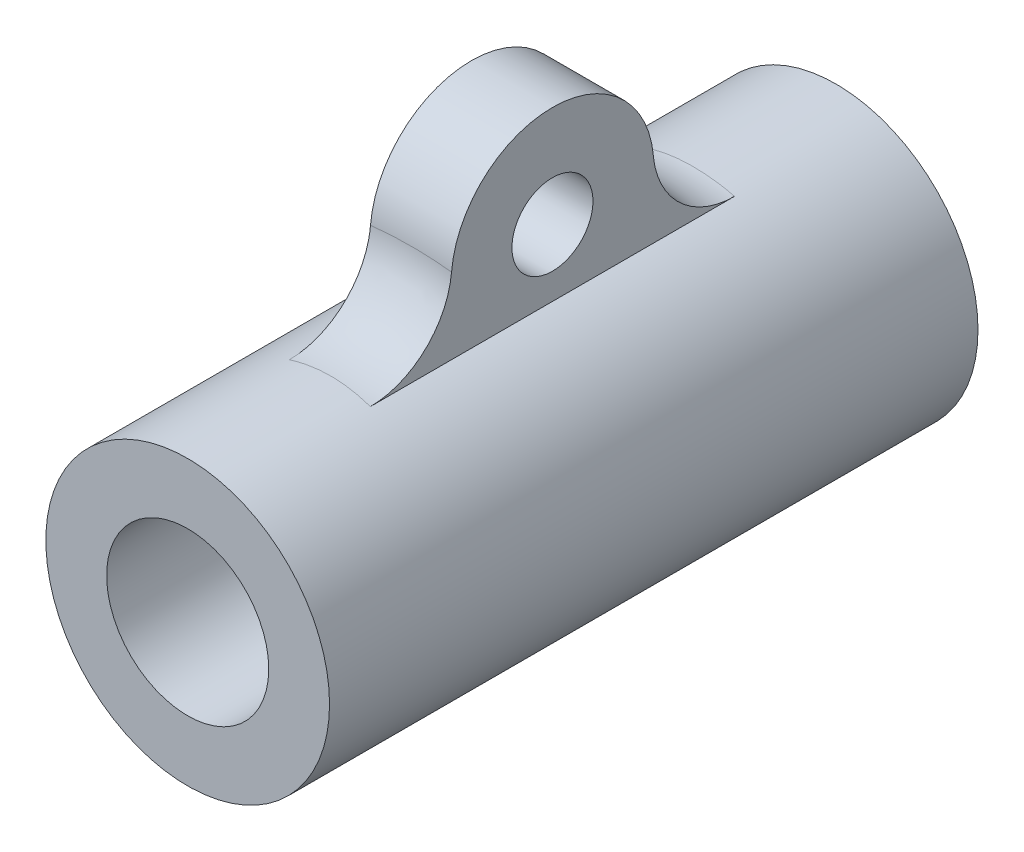
ISO-10303-21;
HEADER;
FILE_DESCRIPTION(('STEP AP214'),'2;1');
FILE_NAME('part.step','',(''),(''),'','','');
FILE_SCHEMA(('AUTOMOTIVE_DESIGN { 1 0 10303 214 1 1 1 1 }'));
ENDSEC;
DATA;
#1=APPLICATION_CONTEXT('core data for automotive mechanical design processes');
#2=APPLICATION_PROTOCOL_DEFINITION('international standard','automotive_design',2000,#1);
#3=PRODUCT_CONTEXT('',#1,'mechanical');
#4=PRODUCT('Part','Part','',(#3));
#5=PRODUCT_RELATED_PRODUCT_CATEGORY('part','',(#4));
#6=PRODUCT_DEFINITION_FORMATION('','',#4);
#7=PRODUCT_DEFINITION_CONTEXT('part definition',#1,'design');
#8=PRODUCT_DEFINITION('design','',#6,#7);
#9=PRODUCT_DEFINITION_SHAPE('','',#8);
#10=(LENGTH_UNIT() NAMED_UNIT(*) SI_UNIT(.MILLI.,.METRE.));
#11=(NAMED_UNIT(*) PLANE_ANGLE_UNIT() SI_UNIT($,.RADIAN.));
#12=(NAMED_UNIT(*) SI_UNIT($,.STERADIAN.) SOLID_ANGLE_UNIT());
#13=UNCERTAINTY_MEASURE_WITH_UNIT(LENGTH_MEASURE(1.E-05),#10,'distance_accuracy_value','');
#14=(GEOMETRIC_REPRESENTATION_CONTEXT(3) GLOBAL_UNCERTAINTY_ASSIGNED_CONTEXT((#13)) GLOBAL_UNIT_ASSIGNED_CONTEXT((#10,
#11,#12)) REPRESENTATION_CONTEXT('',''));
#15=CARTESIAN_POINT('',(0.,0.,0.));
#16=DIRECTION('',(0.,0.,1.));
#17=DIRECTION('',(1.,0.,0.));
#18=AXIS2_PLACEMENT_3D('',#15,#16,#17);
#19=CARTESIAN_POINT('',(0.,0.,25.4));
#20=DIRECTION('',(0.,0.,1.));
#21=DIRECTION('',(1.,0.,0.));
#22=AXIS2_PLACEMENT_3D('',#19,#20,#21);
#23=PLANE('',#22);
#24=CARTESIAN_POINT('',(0.,0.,25.4));
#25=DIRECTION('',(0.,0.,1.));
#26=DIRECTION('',(1.,0.,0.));
#27=AXIS2_PLACEMENT_3D('',#24,#25,#26);
#28=CIRCLE('',#27,11.1125);
#29=CARTESIAN_POINT('',(11.1125,0.,25.4));
#30=VERTEX_POINT('',#29);
#31=EDGE_CURVE('E219',#30,#30,#28,.T.);
#32=ORIENTED_EDGE('',*,*,#31,.T.);
#33=EDGE_LOOP('',(#32));
#34=FACE_BOUND('',#33,.T.);
#35=CARTESIAN_POINT('',(0.,0.,25.4));
#36=DIRECTION('',(0.,0.,1.));
#37=DIRECTION('',(1.,0.,0.));
#38=AXIS2_PLACEMENT_3D('',#35,#36,#37);
#39=CIRCLE('',#38,6.35);
#40=CARTESIAN_POINT('',(6.35,0.,25.4));
#41=VERTEX_POINT('',#40);
#42=EDGE_CURVE('E213',#41,#41,#39,.T.);
#43=ORIENTED_EDGE('',*,*,#42,.F.);
#44=EDGE_LOOP('',(#43));
#45=FACE_BOUND('',#44,.T.);
#46=ADVANCED_FACE('F39',(#34,#45),#23,.T.);
#47=CARTESIAN_POINT('',(0.,0.,-25.4));
#48=DIRECTION('',(0.,0.,1.));
#49=DIRECTION('',(1.,0.,0.));
#50=AXIS2_PLACEMENT_3D('',#47,#48,#49);
#51=PLANE('',#50);
#52=CARTESIAN_POINT('',(0.,0.,-25.4));
#53=DIRECTION('',(0.,0.,1.));
#54=DIRECTION('',(1.,0.,0.));
#55=AXIS2_PLACEMENT_3D('',#52,#53,#54);
#56=CIRCLE('',#55,11.1125);
#57=CARTESIAN_POINT('',(11.1125,0.,-25.4));
#58=VERTEX_POINT('',#57);
#59=EDGE_CURVE('E216',#58,#58,#56,.T.);
#60=ORIENTED_EDGE('',*,*,#59,.F.);
#61=EDGE_LOOP('',(#60));
#62=FACE_BOUND('',#61,.T.);
#63=CARTESIAN_POINT('',(0.,0.,-25.4));
#64=DIRECTION('',(0.,0.,1.));
#65=DIRECTION('',(1.,0.,0.));
#66=AXIS2_PLACEMENT_3D('',#63,#64,#65);
#67=CIRCLE('',#66,6.35);
#68=CARTESIAN_POINT('',(6.35,0.,-25.4));
#69=VERTEX_POINT('',#68);
#70=EDGE_CURVE('E100',#69,#69,#67,.T.);
#71=ORIENTED_EDGE('',*,*,#70,.T.);
#72=EDGE_LOOP('',(#71));
#73=FACE_BOUND('',#72,.T.);
#74=ADVANCED_FACE('F153',(#62,#73),#51,.F.);
#75=CARTESIAN_POINT('',(0.,0.,25.4));
#76=DIRECTION('',(0.,0.,-1.));
#77=DIRECTION('',(-1.,0.,0.));
#78=AXIS2_PLACEMENT_3D('',#75,#76,#77);
#79=CYLINDRICAL_SURFACE('',#78,11.1125);
#80=DIRECTION('',(0.,0.,-1.));
#81=VECTOR('',#80,1.);
#82=CARTESIAN_POINT('',(3.175,10.6492737428428,25.4));
#83=LINE('',#82,#81);
#84=CARTESIAN_POINT('',(3.175,10.6492737428428,-14.2616194895814));
#85=VERTEX_POINT('',#84);
#86=CARTESIAN_POINT('',(3.175,10.6492737428428,14.2616194895814));
#87=VERTEX_POINT('',#86);
#88=EDGE_CURVE('E60',#85,#87,#83,.F.);
#89=ORIENTED_EDGE('',*,*,#88,.T.);
#90=CARTESIAN_POINT('',(4.46461379024299,10.1761918198299,14.2870278027196));
#91=CARTESIAN_POINT('',(4.48346733485135,10.1679201798349,7.98416291189731));
#92=CARTESIAN_POINT('',(7.01582167038185,15.9395325411213,7.93723766817754));
#93=CARTESIAN_POINT('',(4.33154014334243,10.2345753046005,14.2862772176435));
#94=CARTESIAN_POINT('',(4.36508340525394,10.2201647314617,8.02070093490109));
#95=CARTESIAN_POINT('',(6.80670593953739,15.9905022500984,7.93682067764308));
#96=CARTESIAN_POINT('',(4.19733848308518,10.2903407112571,14.2846862781797));
#97=CARTESIAN_POINT('',(4.24317385232084,10.2714958532903,8.05519035271239));
#98=CARTESIAN_POINT('',(6.59581761627624,16.0391863352578,7.93593682199012));
#99=CARTESIAN_POINT('',(3.92686122010344,10.3965634598014,14.2802585444643));
#100=CARTESIAN_POINT('',(3.99356538053318,10.371207010043,8.11995528150882));
#101=CARTESIAN_POINT('',(6.17078191730588,16.1319204807454,7.93347696835723));
#102=CARTESIAN_POINT('',(3.79058565282938,10.447020892305,14.2774217714853));
#103=CARTESIAN_POINT('',(3.86584534760146,10.4196239983928,8.15026724032915));
#104=CARTESIAN_POINT('',(5.95663459730451,16.1759706201827,7.93190098219548));
#105=CARTESIAN_POINT('',(3.37886868633746,10.5903421161357,14.2676937899221));
#106=CARTESIAN_POINT('',(3.47562756976165,10.5590380920943,8.23493283427822));
#107=CARTESIAN_POINT('',(5.3096507928179,16.3010923234805,7.92649654684823));
#108=CARTESIAN_POINT('',(3.1005814032622,10.6751353674889,14.2595854575633));
#109=CARTESIAN_POINT('',(3.20397455295219,10.6451040597964,8.28361720980116));
#110=CARTESIAN_POINT('',(4.87234220512678,16.3751181779433,7.92199192016393));
#111=CARTESIAN_POINT('',(2.5394613013871,10.8223190075173,14.2430944767544));
#112=CARTESIAN_POINT('',(2.6456226580094,10.7973495220386,8.36603781195924));
#113=CARTESIAN_POINT('',(3.99058204503641,16.5036118319827,7.9128302655651));
#114=CARTESIAN_POINT('',(2.25665311339662,10.8848039715464,14.2347131547851));
#115=CARTESIAN_POINT('',(2.35854284241874,10.8639190437405,8.40003507527986));
#116=CARTESIAN_POINT('',(3.54616917819472,16.5581621973452,7.90817397459888));
#117=CARTESIAN_POINT('',(1.68710927015211,10.9874927366723,14.2198521062712));
#118=CARTESIAN_POINT('',(1.77339179131906,10.9744348597025,8.45487070671548));
#119=CARTESIAN_POINT('',(2.65117171023933,16.6478111192628,7.89991783610144));
#120=CARTESIAN_POINT('',(1.40037535091559,11.0277060800149,14.2133715659));
#121=CARTESIAN_POINT('',(1.47472199178352,11.0186395215983,8.4758486485888));
#122=CARTESIAN_POINT('',(2.20058983715315,16.68291800635,7.89631753644367));
#123=CARTESIAN_POINT('',(0.849455389387629,11.0831398301495,14.2041747134168));
#124=CARTESIAN_POINT('',(0.897393181636988,11.0797612606944,8.50447459368468));
#125=CARTESIAN_POINT('',(1.33485846903763,16.7313125501417,7.89120817427347));
#126=CARTESIAN_POINT('',(0.585456263917187,11.1002158149128,14.2011820796085));
#127=CARTESIAN_POINT('',(0.618738317790818,11.0988175412265,8.51317123286857));
#128=CARTESIAN_POINT('',(0.920002700441267,16.7462201558739,7.88954559977035));
#129=CARTESIAN_POINT('',(0.0569031199796205,11.1154993305016,14.1985087057142));
#130=CARTESIAN_POINT('',(0.0603920051670209,11.1158340260266,8.52094443117031));
#131=CARTESIAN_POINT('',(0.0894191885394314,16.7595629075832,7.88806039207555));
#132=CARTESIAN_POINT('',(-0.207650911698906,11.1137064068724,14.1988280453965));
#133=CARTESIAN_POINT('',(-0.219867384558824,11.11382845606,8.52003661138951));
#134=CARTESIAN_POINT('',(-0.326308575526816,16.7579976568141,7.88823780319964));
#135=CARTESIAN_POINT('',(-0.78234165500161,11.0892817850724,14.2030818515208));
#136=CARTESIAN_POINT('',(-0.826495358882273,11.0866506766782,8.50759511501453));
#137=CARTESIAN_POINT('',(-1.22939402928829,16.7366745742452,7.89060102838574));
#138=CARTESIAN_POINT('',(-1.09233003569768,11.06304820666,14.2076409192529));
#139=CARTESIAN_POINT('',(-1.15309781536816,11.0573985977466,8.4941897774203));
#140=CARTESIAN_POINT('',(-1.71651862752507,16.7137722438067,7.89313384301525));
#141=CARTESIAN_POINT('',(-1.70913083281278,10.9846827891209,14.2201851110168));
#142=CARTESIAN_POINT('',(-1.79597916523198,10.9715670630338,8.45334240345556));
#143=CARTESIAN_POINT('',(-2.68577702299167,16.6453579903979,7.90010283842069));
#144=CARTESIAN_POINT('',(-2.01594144776982,10.9325370017025,14.2281720799386));
#145=CARTESIAN_POINT('',(-2.11309006429761,10.9147394871698,8.42577736176764));
#146=CARTESIAN_POINT('',(-3.16790798935262,16.5998338903476,7.90454004413639));
#147=CARTESIAN_POINT('',(-2.62571073255053,10.8023587244268,14.2454541125462));
#148=CARTESIAN_POINT('',(-2.73240391686623,10.7766039199111,8.35499423410979));
#149=CARTESIAN_POINT('',(-4.12611686543651,16.4861861880194,7.91414117391218));
#150=CARTESIAN_POINT('',(-2.92864128342633,10.7241937808338,14.2547557262412));
#151=CARTESIAN_POINT('',(-3.0352025042978,10.6948228203801,8.3114956764691));
#152=CARTESIAN_POINT('',(-4.60215058824137,16.4179469515274,7.91930873686127));
#153=CARTESIAN_POINT('',(-3.37715851757639,10.5880537704912,14.2672690450642));
#154=CARTESIAN_POINT('',(-3.47138162028122,10.5579556315964,8.23339581834799));
#155=CARTESIAN_POINT('',(-5.3069633847629,16.299094561537,7.92626058056095));
#156=CARTESIAN_POINT('',(-3.52566641207028,10.5395322022595,14.2711999020517));
#157=CARTESIAN_POINT('',(-3.61436063792985,10.509738204485,8.20507920044447));
#158=CARTESIAN_POINT('',(-5.5403329332533,16.2567344622883,7.92844439000668));
#159=CARTESIAN_POINT('',(-3.8205143879583,10.4362693951329,14.2780863267374));
#160=CARTESIAN_POINT('',(-3.89413785784157,10.409209416567,8.14384381536831));
#161=CARTESIAN_POINT('',(-6.00366546679161,16.1665843925772,7.93227018152216));
#162=CARTESIAN_POINT('',(-3.96685445031512,10.3815281016545,14.2810418858757));
#163=CARTESIAN_POINT('',(-4.03097785360912,10.3568490593557,8.11088385781185));
#164=CARTESIAN_POINT('',(-6.23362842192377,16.1187943744626,7.93391215883637));
#165=CARTESIAN_POINT('',(-4.11199847605204,10.3237166167493,14.2832616689717));
#166=CARTESIAN_POINT('',(-4.16398898362548,10.3030084846059,8.07560581518497));
#167=CARTESIAN_POINT('',(-6.46171189093892,16.0683240304954,7.93514537165092));
#168=(BOUNDED_SURFACE() B_SPLINE_SURFACE(3,2,((#90,#91,#92),(#93,#94,#95),(#96,#97,#98),(#99,
#100,#101),(#102,#103,#104),(#105,#106,#107),(#108,#109,#110),(#111,#112,#113),(#114,#115,#116),
(#117,#118,#119),(#120,#121,#122),(#123,#124,#125),(#126,#127,#128),(#129,#130,#131),(#132,#133,
#134),(#135,#136,#137),(#138,#139,#140),(#141,#142,#143),(#144,#145,#146),(#147,#148,#149),
(#150,#151,#152),(#153,#154,#155),(#156,#157,#158),(#159,#160,#161),(#162,#163,#164),(#165,#166,
#167)),.UNSPECIFIED.,.F.,.F.,.F.) B_SPLINE_SURFACE_WITH_KNOTS((4,2,2,2,2,2,2,2,2,2,2,2,4),(3,3),
(0.,0.684975155164863,1.36993861479184,2.74009336205547,4.10436839973577,5.46805846253239,
6.71419922149175,7.96036999362854,9.4252374346861,10.8908942553011,12.3641292897719,
13.100563848175,13.8370048699137),(0.,1.),
.UNSPECIFIED.) GEOMETRIC_REPRESENTATION_ITEM() RATIONAL_B_SPLINE_SURFACE(((1.,0.709734128311728,
1.),(1.,0.711820719538304,1.),(1.,0.713839715172821,1.),(1.,0.717726305382431,1.),(1.,
0.719593902542017,1.),(1.,0.724945979482716,1.),(1.,0.728179039940343,1.),(1.,0.73385623676971,
1.),(1.,0.736303699094032,1.),(1.,0.740354264436762,1.),(1.,0.74195772905022,1.),(1.,
0.744174802408058,1.),(1.,0.744861821872912,1.),(1.,0.745476597934358,1.),(1.,0.74540433624378,
1.),(1.,0.744422325782521,1.),(1.,0.743367827814133,1.),(1.,0.740245367002487,1.),(1.,
0.738176858335169,1.),(1.,0.733083065161156,1.),(1.,0.730052888922134,1.),(1.,0.724877041894932,
1.),(1.,0.723046928955433,1.),(1.,0.719194270430117,1.),(1.,0.717171723155552,1.),(1.,
0.715061874987908,1.))) REPRESENTATION_ITEM('') SURFACE());
#169=CARTESIAN_POINT('',(4.46461379024299,10.1761918198299,14.2870278027196));
#170=CARTESIAN_POINT('',(4.33154014334243,10.2345753046005,14.2862772176435));
#171=CARTESIAN_POINT('',(4.19733848308518,10.2903407112571,14.2846862781797));
#172=CARTESIAN_POINT('',(3.92686122010344,10.3965634598014,14.2802585444643));
#173=CARTESIAN_POINT('',(3.79058565282938,10.447020892305,14.2774217714853));
#174=CARTESIAN_POINT('',(3.37886868633746,10.5903421161357,14.2676937899221));
#175=CARTESIAN_POINT('',(3.1005814032622,10.6751353674889,14.2595854575633));
#176=CARTESIAN_POINT('',(2.5394613013871,10.8223190075173,14.2430944767544));
#177=CARTESIAN_POINT('',(2.25665311339662,10.8848039715464,14.2347131547851));
#178=CARTESIAN_POINT('',(1.68710927015211,10.9874927366723,14.2198521062712));
#179=CARTESIAN_POINT('',(1.40037535091559,11.0277060800149,14.2133715659));
#180=CARTESIAN_POINT('',(0.849455389387629,11.0831398301495,14.2041747134168));
#181=CARTESIAN_POINT('',(0.585456263917187,11.1002158149128,14.2011820796085));
#182=CARTESIAN_POINT('',(0.0569031199796205,11.1154993305016,14.1985087057142));
#183=CARTESIAN_POINT('',(-0.207650911698906,11.1137064068724,14.1988280453965));
#184=CARTESIAN_POINT('',(-0.782341655001609,11.0892817850724,14.2030818515208));
#185=CARTESIAN_POINT('',(-1.09233003569768,11.06304820666,14.2076409192529));
#186=CARTESIAN_POINT('',(-1.70913083281278,10.9846827891209,14.2201851110168));
#187=CARTESIAN_POINT('',(-2.01594144776982,10.9325370017025,14.2281720799386));
#188=CARTESIAN_POINT('',(-2.62571073255053,10.8023587244268,14.2454541125462));
#189=CARTESIAN_POINT('',(-2.92864128342633,10.7241937808338,14.2547557262412));
#190=CARTESIAN_POINT('',(-3.37715851757639,10.5880537704912,14.2672690450642));
#191=CARTESIAN_POINT('',(-3.52566641207028,10.5395322022595,14.2711999020517));
#192=CARTESIAN_POINT('',(-3.8205143879583,10.4362693951329,14.2780863267374));
#193=CARTESIAN_POINT('',(-3.96685445031512,10.3815281016545,14.2810418858758));
#194=CARTESIAN_POINT('',(-4.11199847605204,10.3237166167493,14.2832616689717));
#195=B_SPLINE_CURVE_WITH_KNOTS('',3,(#169,#170,#171,#172,#173,#174,#175,#176,#177,#178,#179,
#180,#181,#182,#183,#184,#185,#186,#187,#188,#189,#190,#191,#192,#193,#194),.UNSPECIFIED.,.F.,
.F.,(4,2,2,2,2,2,2,2,2,2,2,2,4),(0.,0.684975155164863,1.36993861479184,2.74009336205547,
4.10436839973577,5.46805846253239,6.71419922149175,7.96036999362854,9.4252374346861,
10.8908942553011,12.3641292897719,13.100563848175,13.8370048699137),.UNSPECIFIED.);
#196=CARTESIAN_POINT('',(-3.175,10.6492737428428,14.2616194895814));
#197=VERTEX_POINT('',#196);
#198=EDGE_CURVE('E158',#87,#197,#195,.T.);
#199=ORIENTED_EDGE('',*,*,#198,.T.);
#200=DIRECTION('',(0.,0.,-1.));
#201=VECTOR('',#200,1.);
#202=CARTESIAN_POINT('',(-3.175,10.6492737428428,25.4));
#203=LINE('',#202,#201);
#204=CARTESIAN_POINT('',(-3.175,10.6492737428428,-14.2616194895814));
#205=VERTEX_POINT('',#204);
#206=EDGE_CURVE('E68',#205,#197,#203,.F.);
#207=ORIENTED_EDGE('',*,*,#206,.F.);
#208=CARTESIAN_POINT('',(-4.46461379024299,10.1761918198299,-14.2870278027196));
#209=CARTESIAN_POINT('',(-4.48346733485135,10.1679201798349,-7.98416291189731));
#210=CARTESIAN_POINT('',(-7.01582167038185,15.9395325411213,-7.93723766817754));
#211=CARTESIAN_POINT('',(-4.33154014334243,10.2345753046005,-14.2862772176435));
#212=CARTESIAN_POINT('',(-4.36508340525394,10.2201647314617,-8.02070093490109));
#213=CARTESIAN_POINT('',(-6.80670593953739,15.9905022500984,-7.93682067764308));
#214=CARTESIAN_POINT('',(-4.19733848308518,10.2903407112571,-14.2846862781797));
#215=CARTESIAN_POINT('',(-4.24317385232084,10.2714958532903,-8.05519035271239));
#216=CARTESIAN_POINT('',(-6.59581761627624,16.0391863352578,-7.93593682199012));
#217=CARTESIAN_POINT('',(-3.92686122010344,10.3965634598014,-14.2802585444643));
#218=CARTESIAN_POINT('',(-3.99356538053318,10.371207010043,-8.11995528150882));
#219=CARTESIAN_POINT('',(-6.17078191730588,16.1319204807454,-7.93347696835723));
#220=CARTESIAN_POINT('',(-3.79058565282938,10.447020892305,-14.2774217714853));
#221=CARTESIAN_POINT('',(-3.86584534760146,10.4196239983928,-8.15026724032915));
#222=CARTESIAN_POINT('',(-5.95663459730451,16.1759706201827,-7.93190098219548));
#223=CARTESIAN_POINT('',(-3.37886868633746,10.5903421161357,-14.2676937899221));
#224=CARTESIAN_POINT('',(-3.47562756976165,10.5590380920943,-8.23493283427822));
#225=CARTESIAN_POINT('',(-5.3096507928179,16.3010923234805,-7.92649654684823));
#226=CARTESIAN_POINT('',(-3.1005814032622,10.6751353674889,-14.2595854575633));
#227=CARTESIAN_POINT('',(-3.20397455295219,10.6451040597964,-8.28361720980116));
#228=CARTESIAN_POINT('',(-4.87234220512678,16.3751181779433,-7.92199192016393));
#229=CARTESIAN_POINT('',(-2.5394613013871,10.8223190075173,-14.2430944767544));
#230=CARTESIAN_POINT('',(-2.6456226580094,10.7973495220386,-8.36603781195924));
#231=CARTESIAN_POINT('',(-3.99058204503641,16.5036118319827,-7.9128302655651));
#232=CARTESIAN_POINT('',(-2.25665311339662,10.8848039715464,-14.2347131547851));
#233=CARTESIAN_POINT('',(-2.35854284241874,10.8639190437405,-8.40003507527986));
#234=CARTESIAN_POINT('',(-3.54616917819472,16.5581621973452,-7.90817397459888));
#235=CARTESIAN_POINT('',(-1.68710927015211,10.9874927366723,-14.2198521062712));
#236=CARTESIAN_POINT('',(-1.77339179131906,10.9744348597025,-8.45487070671548));
#237=CARTESIAN_POINT('',(-2.65117171023933,16.6478111192628,-7.89991783610144));
#238=CARTESIAN_POINT('',(-1.40037535091559,11.0277060800149,-14.2133715659));
#239=CARTESIAN_POINT('',(-1.47472199178352,11.0186395215983,-8.4758486485888));
#240=CARTESIAN_POINT('',(-2.20058983715315,16.68291800635,-7.89631753644367));
#241=CARTESIAN_POINT('',(-0.849455389387629,11.0831398301495,-14.2041747134168));
#242=CARTESIAN_POINT('',(-0.897393181636988,11.0797612606944,-8.50447459368468));
#243=CARTESIAN_POINT('',(-1.33485846903763,16.7313125501417,-7.89120817427347));
#244=CARTESIAN_POINT('',(-0.585456263917187,11.1002158149128,-14.2011820796085));
#245=CARTESIAN_POINT('',(-0.618738317790818,11.0988175412265,-8.51317123286857));
#246=CARTESIAN_POINT('',(-0.920002700441267,16.7462201558739,-7.88954559977035));
#247=CARTESIAN_POINT('',(-0.0569031199796205,11.1154993305016,-14.1985087057142));
#248=CARTESIAN_POINT('',(-0.0603920051670209,11.1158340260266,-8.52094443117031));
#249=CARTESIAN_POINT('',(-0.0894191885394314,16.7595629075832,-7.88806039207555));
#250=CARTESIAN_POINT('',(0.207650911698906,11.1137064068724,-14.1988280453965));
#251=CARTESIAN_POINT('',(0.219867384558824,11.11382845606,-8.52003661138951));
#252=CARTESIAN_POINT('',(0.326308575526816,16.7579976568141,-7.88823780319964));
#253=CARTESIAN_POINT('',(0.78234165500161,11.0892817850724,-14.2030818515208));
#254=CARTESIAN_POINT('',(0.826495358882273,11.0866506766782,-8.50759511501453));
#255=CARTESIAN_POINT('',(1.22939402928829,16.7366745742452,-7.89060102838574));
#256=CARTESIAN_POINT('',(1.09233003569768,11.06304820666,-14.2076409192529));
#257=CARTESIAN_POINT('',(1.15309781536816,11.0573985977466,-8.4941897774203));
#258=CARTESIAN_POINT('',(1.71651862752507,16.7137722438067,-7.89313384301525));
#259=CARTESIAN_POINT('',(1.70913083281278,10.9846827891209,-14.2201851110168));
#260=CARTESIAN_POINT('',(1.79597916523198,10.9715670630338,-8.45334240345556));
#261=CARTESIAN_POINT('',(2.68577702299167,16.6453579903979,-7.90010283842069));
#262=CARTESIAN_POINT('',(2.01594144776982,10.9325370017025,-14.2281720799386));
#263=CARTESIAN_POINT('',(2.11309006429761,10.9147394871698,-8.42577736176764));
#264=CARTESIAN_POINT('',(3.16790798935262,16.5998338903476,-7.90454004413639));
#265=CARTESIAN_POINT('',(2.62571073255053,10.8023587244268,-14.2454541125462));
#266=CARTESIAN_POINT('',(2.73240391686623,10.7766039199111,-8.35499423410979));
#267=CARTESIAN_POINT('',(4.12611686543651,16.4861861880194,-7.91414117391218));
#268=CARTESIAN_POINT('',(2.92864128342633,10.7241937808338,-14.2547557262412));
#269=CARTESIAN_POINT('',(3.0352025042978,10.6948228203801,-8.3114956764691));
#270=CARTESIAN_POINT('',(4.60215058824137,16.4179469515274,-7.91930873686127));
#271=CARTESIAN_POINT('',(3.37715851757639,10.5880537704912,-14.2672690450642));
#272=CARTESIAN_POINT('',(3.47138162028122,10.5579556315964,-8.23339581834799));
#273=CARTESIAN_POINT('',(5.3069633847629,16.299094561537,-7.92626058056095));
#274=CARTESIAN_POINT('',(3.52566641207028,10.5395322022595,-14.2711999020517));
#275=CARTESIAN_POINT('',(3.61436063792985,10.509738204485,-8.20507920044447));
#276=CARTESIAN_POINT('',(5.5403329332533,16.2567344622883,-7.92844439000668));
#277=CARTESIAN_POINT('',(3.8205143879583,10.4362693951329,-14.2780863267374));
#278=CARTESIAN_POINT('',(3.89413785784157,10.409209416567,-8.14384381536831));
#279=CARTESIAN_POINT('',(6.00366546679161,16.1665843925772,-7.93227018152216));
#280=CARTESIAN_POINT('',(3.96685445031512,10.3815281016545,-14.2810418858757));
#281=CARTESIAN_POINT('',(4.03097785360912,10.3568490593557,-8.11088385781185));
#282=CARTESIAN_POINT('',(6.23362842192377,16.1187943744626,-7.93391215883637));
#283=CARTESIAN_POINT('',(4.11199847605204,10.3237166167493,-14.2832616689717));
#284=CARTESIAN_POINT('',(4.16398898362548,10.3030084846059,-8.07560581518497));
#285=CARTESIAN_POINT('',(6.46171189093892,16.0683240304954,-7.93514537165092));
#286=(BOUNDED_SURFACE() B_SPLINE_SURFACE(3,2,((#208,#209,#210),(#211,#212,#213),(#214,#215,
#216),(#217,#218,#219),(#220,#221,#222),(#223,#224,#225),(#226,#227,#228),(#229,#230,#231),
(#232,#233,#234),(#235,#236,#237),(#238,#239,#240),(#241,#242,#243),(#244,#245,#246),(#247,#248,
#249),(#250,#251,#252),(#253,#254,#255),(#256,#257,#258),(#259,#260,#261),(#262,#263,#264),
(#265,#266,#267),(#268,#269,#270),(#271,#272,#273),(#274,#275,#276),(#277,#278,#279),(#280,#281,
#282),(#283,#284,#285)),.UNSPECIFIED.,.F.,.F.,.F.) B_SPLINE_SURFACE_WITH_KNOTS((4,2,2,2,2,2,2,2,
2,2,2,2,4),(3,3),(0.,0.684975155164863,1.36993861479184,2.74009336205547,4.10436839973577,
5.46805846253239,6.71419922149175,7.96036999362854,9.4252374346861,10.8908942553011,
12.3641292897719,13.100563848175,13.8370048699137),(0.,1.),
.UNSPECIFIED.) GEOMETRIC_REPRESENTATION_ITEM() RATIONAL_B_SPLINE_SURFACE(((1.,0.709734128311728,
1.),(1.,0.711820719538304,1.),(1.,0.713839715172821,1.),(1.,0.717726305382431,1.),(1.,
0.719593902542017,1.),(1.,0.724945979482716,1.),(1.,0.728179039940343,1.),(1.,0.73385623676971,
1.),(1.,0.736303699094032,1.),(1.,0.740354264436762,1.),(1.,0.74195772905022,1.),(1.,
0.744174802408058,1.),(1.,0.744861821872912,1.),(1.,0.745476597934358,1.),(1.,0.74540433624378,
1.),(1.,0.744422325782521,1.),(1.,0.743367827814133,1.),(1.,0.740245367002487,1.),(1.,
0.738176858335169,1.),(1.,0.733083065161156,1.),(1.,0.730052888922134,1.),(1.,0.724877041894932,
1.),(1.,0.723046928955433,1.),(1.,0.719194270430117,1.),(1.,0.717171723155552,1.),(1.,
0.715061874987908,1.))) REPRESENTATION_ITEM('') SURFACE());
#287=CARTESIAN_POINT('',(-4.46461379024299,10.1761918198299,-14.2870278027196));
#288=CARTESIAN_POINT('',(-4.33154014334243,10.2345753046005,-14.2862772176435));
#289=CARTESIAN_POINT('',(-4.19733848308518,10.2903407112571,-14.2846862781797));
#290=CARTESIAN_POINT('',(-3.92686122010344,10.3965634598014,-14.2802585444643));
#291=CARTESIAN_POINT('',(-3.79058565282938,10.447020892305,-14.2774217714853));
#292=CARTESIAN_POINT('',(-3.37886868633746,10.5903421161357,-14.2676937899221));
#293=CARTESIAN_POINT('',(-3.1005814032622,10.6751353674889,-14.2595854575633));
#294=CARTESIAN_POINT('',(-2.5394613013871,10.8223190075173,-14.2430944767544));
#295=CARTESIAN_POINT('',(-2.25665311339662,10.8848039715464,-14.2347131547851));
#296=CARTESIAN_POINT('',(-1.68710927015211,10.9874927366723,-14.2198521062712));
#297=CARTESIAN_POINT('',(-1.40037535091559,11.0277060800149,-14.2133715659));
#298=CARTESIAN_POINT('',(-0.849455389387629,11.0831398301495,-14.2041747134168));
#299=CARTESIAN_POINT('',(-0.585456263917187,11.1002158149128,-14.2011820796085));
#300=CARTESIAN_POINT('',(-0.0569031199796205,11.1154993305016,-14.1985087057142));
#301=CARTESIAN_POINT('',(0.207650911698906,11.1137064068724,-14.1988280453965));
#302=CARTESIAN_POINT('',(0.782341655001609,11.0892817850724,-14.2030818515208));
#303=CARTESIAN_POINT('',(1.09233003569768,11.06304820666,-14.2076409192529));
#304=CARTESIAN_POINT('',(1.70913083281278,10.9846827891209,-14.2201851110168));
#305=CARTESIAN_POINT('',(2.01594144776982,10.9325370017025,-14.2281720799386));
#306=CARTESIAN_POINT('',(2.62571073255053,10.8023587244268,-14.2454541125462));
#307=CARTESIAN_POINT('',(2.92864128342633,10.7241937808338,-14.2547557262412));
#308=CARTESIAN_POINT('',(3.37715851757639,10.5880537704912,-14.2672690450642));
#309=CARTESIAN_POINT('',(3.52566641207028,10.5395322022595,-14.2711999020517));
#310=CARTESIAN_POINT('',(3.8205143879583,10.4362693951329,-14.2780863267374));
#311=CARTESIAN_POINT('',(3.96685445031512,10.3815281016545,-14.2810418858758));
#312=CARTESIAN_POINT('',(4.11199847605204,10.3237166167493,-14.2832616689717));
#313=B_SPLINE_CURVE_WITH_KNOTS('',3,(#287,#288,#289,#290,#291,#292,#293,#294,#295,#296,#297,
#298,#299,#300,#301,#302,#303,#304,#305,#306,#307,#308,#309,#310,#311,#312),.UNSPECIFIED.,.F.,
.F.,(4,2,2,2,2,2,2,2,2,2,2,2,4),(0.,0.684975155164863,1.36993861479184,2.74009336205547,
4.10436839973577,5.46805846253239,6.71419922149175,7.96036999362854,9.4252374346861,
10.8908942553011,12.3641292897719,13.100563848175,13.8370048699137),.UNSPECIFIED.);
#314=EDGE_CURVE('E105',#205,#85,#313,.T.);
#315=ORIENTED_EDGE('',*,*,#314,.T.);
#316=EDGE_LOOP('',(#89,#199,#207,#315));
#317=FACE_BOUND('',#316,.T.);
#318=ORIENTED_EDGE('',*,*,#31,.F.);
#319=EDGE_LOOP('',(#318));
#320=FACE_BOUND('',#319,.T.);
#321=ORIENTED_EDGE('',*,*,#59,.T.);
#322=EDGE_LOOP('',(#321));
#323=FACE_BOUND('',#322,.T.);
#324=ADVANCED_FACE('F149',(#317,#320,#323),#79,.T.);
#325=CARTESIAN_POINT('',(0.,0.,25.4));
#326=DIRECTION('',(0.,0.,-1.));
#327=DIRECTION('',(-1.,0.,0.));
#328=AXIS2_PLACEMENT_3D('',#325,#326,#327);
#329=CYLINDRICAL_SURFACE('',#328,6.35);
#330=ORIENTED_EDGE('',*,*,#42,.T.);
#331=EDGE_LOOP('',(#330));
#332=FACE_BOUND('',#331,.T.);
#333=ORIENTED_EDGE('',*,*,#70,.F.);
#334=EDGE_LOOP('',(#333));
#335=FACE_BOUND('',#334,.T.);
#336=ADVANCED_FACE('F128',(#332,#335),#329,.F.);
#337=CARTESIAN_POINT('',(3.175,15.875,0.));
#338=DIRECTION('',(-1.,0.,0.));
#339=DIRECTION('',(0.,0.,1.));
#340=AXIS2_PLACEMENT_3D('',#337,#338,#339);
#341=CYLINDRICAL_SURFACE('',#340,7.9375);
#342=CARTESIAN_POINT('',(-3.175,15.875,0.));
#343=DIRECTION('',(1.,0.,0.));
#344=DIRECTION('',(0.,0.,-1.));
#345=AXIS2_PLACEMENT_3D('',#342,#343,#344);
#346=CIRCLE('',#345,7.9375);
#347=CARTESIAN_POINT('',(-3.175,16.5952433052207,-7.90475526700762));
#348=VERTEX_POINT('',#347);
#349=CARTESIAN_POINT('',(-3.175,16.5952433052207,7.90475526700762));
#350=VERTEX_POINT('',#349);
#351=EDGE_CURVE('E205',#348,#350,#346,.T.);
#352=ORIENTED_EDGE('',*,*,#351,.T.);
#353=CARTESIAN_POINT('',(-6.46171189093892,16.0683240304954,7.93514537165092));
#354=CARTESIAN_POINT('',(-6.23362842192377,16.1187943744626,7.93391215883637));
#355=CARTESIAN_POINT('',(-6.00366546679161,16.1665843925772,7.93227018152216));
#356=CARTESIAN_POINT('',(-5.5403329332533,16.2567344622883,7.92844439000668));
#357=CARTESIAN_POINT('',(-5.3069633847629,16.299094561537,7.92626058056095));
#358=CARTESIAN_POINT('',(-4.60215058824137,16.4179469515274,7.91930873686127));
#359=CARTESIAN_POINT('',(-4.12611686543651,16.4861861880194,7.91414117391218));
#360=CARTESIAN_POINT('',(-3.16790798935262,16.5998338903476,7.90454004413639));
#361=CARTESIAN_POINT('',(-2.68577702299167,16.6453579903979,7.90010283842069));
#362=CARTESIAN_POINT('',(-1.71651862752507,16.7137722438067,7.89313384301525));
#363=CARTESIAN_POINT('',(-1.22939402928829,16.7366745742452,7.89060102838574));
#364=CARTESIAN_POINT('',(-0.326308575526816,16.7579976568141,7.88823780319964));
#365=CARTESIAN_POINT('',(0.089419188539431,16.7595629075832,7.88806039207555));
#366=CARTESIAN_POINT('',(0.920002700441266,16.7462201558739,7.88954559977035));
#367=CARTESIAN_POINT('',(1.33485846903763,16.7313125501417,7.89120817427347));
#368=CARTESIAN_POINT('',(2.20058983715315,16.68291800635,7.89631753644367));
#369=CARTESIAN_POINT('',(2.65117171023933,16.6478111192628,7.89991783610144));
#370=CARTESIAN_POINT('',(3.54616917819472,16.5581621973452,7.90817397459888));
#371=CARTESIAN_POINT('',(3.99058204503641,16.5036118319827,7.9128302655651));
#372=CARTESIAN_POINT('',(4.87234220512678,16.3751181779433,7.92199192016393));
#373=CARTESIAN_POINT('',(5.3096507928179,16.3010923234805,7.92649654684823));
#374=CARTESIAN_POINT('',(5.95663459730451,16.1759706201827,7.93190098219548));
#375=CARTESIAN_POINT('',(6.17078191730588,16.1319204807454,7.93347696835723));
#376=CARTESIAN_POINT('',(6.59581761627624,16.0391863352578,7.93593682199012));
#377=CARTESIAN_POINT('',(6.80670593953739,15.9905022500984,7.93682067764308));
#378=CARTESIAN_POINT('',(7.01582167038185,15.9395325411213,7.93723766817754));
#379=B_SPLINE_CURVE_WITH_KNOTS('',3,(#353,#354,#355,#356,#357,#358,#359,#360,#361,#362,#363,
#364,#365,#366,#367,#368,#369,#370,#371,#372,#373,#374,#375,#376,#377,#378),.UNSPECIFIED.,.F.,
.F.,(4,2,2,2,2,2,2,2,2,2,2,2,4),(0.,0.736441021738702,1.47287558014181,2.9461106146126,
4.41176743522759,5.87663487628515,7.12280564842195,8.3689464073813,9.73263647017792,
11.0969115078582,12.4670662551219,13.1520297147488,13.8370048699137),.UNSPECIFIED.);
#380=CARTESIAN_POINT('',(3.175,16.5952433052207,7.90475526700762));
#381=VERTEX_POINT('',#380);
#382=EDGE_CURVE('E99',#350,#381,#379,.T.);
#383=ORIENTED_EDGE('',*,*,#382,.T.);
#384=CARTESIAN_POINT('',(3.175,15.875,0.));
#385=DIRECTION('',(1.,0.,0.));
#386=DIRECTION('',(0.,0.,-1.));
#387=AXIS2_PLACEMENT_3D('',#384,#385,#386);
#388=CIRCLE('',#387,7.9375);
#389=CARTESIAN_POINT('',(3.175,16.5952433052207,-7.90475526700762));
#390=VERTEX_POINT('',#389);
#391=EDGE_CURVE('E87',#390,#381,#388,.T.);
#392=ORIENTED_EDGE('',*,*,#391,.F.);
#393=CARTESIAN_POINT('',(6.46171189093892,16.0683240304954,-7.93514537165092));
#394=CARTESIAN_POINT('',(6.23362842192377,16.1187943744626,-7.93391215883637));
#395=CARTESIAN_POINT('',(6.00366546679161,16.1665843925772,-7.93227018152216));
#396=CARTESIAN_POINT('',(5.5403329332533,16.2567344622883,-7.92844439000668));
#397=CARTESIAN_POINT('',(5.3069633847629,16.299094561537,-7.92626058056095));
#398=CARTESIAN_POINT('',(4.60215058824137,16.4179469515274,-7.91930873686127));
#399=CARTESIAN_POINT('',(4.12611686543651,16.4861861880194,-7.91414117391218));
#400=CARTESIAN_POINT('',(3.16790798935262,16.5998338903476,-7.90454004413639));
#401=CARTESIAN_POINT('',(2.68577702299167,16.6453579903979,-7.90010283842069));
#402=CARTESIAN_POINT('',(1.71651862752507,16.7137722438067,-7.89313384301525));
#403=CARTESIAN_POINT('',(1.22939402928829,16.7366745742452,-7.89060102838574));
#404=CARTESIAN_POINT('',(0.326308575526816,16.7579976568141,-7.88823780319964));
#405=CARTESIAN_POINT('',(-0.089419188539431,16.7595629075832,-7.88806039207555));
#406=CARTESIAN_POINT('',(-0.920002700441266,16.7462201558739,-7.88954559977035));
#407=CARTESIAN_POINT('',(-1.33485846903763,16.7313125501417,-7.89120817427347));
#408=CARTESIAN_POINT('',(-2.20058983715315,16.68291800635,-7.89631753644367));
#409=CARTESIAN_POINT('',(-2.65117171023933,16.6478111192628,-7.89991783610144));
#410=CARTESIAN_POINT('',(-3.54616917819472,16.5581621973452,-7.90817397459888));
#411=CARTESIAN_POINT('',(-3.99058204503641,16.5036118319827,-7.9128302655651));
#412=CARTESIAN_POINT('',(-4.87234220512678,16.3751181779433,-7.92199192016393));
#413=CARTESIAN_POINT('',(-5.3096507928179,16.3010923234805,-7.92649654684823));
#414=CARTESIAN_POINT('',(-5.95663459730451,16.1759706201827,-7.93190098219548));
#415=CARTESIAN_POINT('',(-6.17078191730588,16.1319204807454,-7.93347696835723));
#416=CARTESIAN_POINT('',(-6.59581761627624,16.0391863352578,-7.93593682199012));
#417=CARTESIAN_POINT('',(-6.80670593953739,15.9905022500984,-7.93682067764308));
#418=CARTESIAN_POINT('',(-7.01582167038185,15.9395325411213,-7.93723766817754));
#419=B_SPLINE_CURVE_WITH_KNOTS('',3,(#393,#394,#395,#396,#397,#398,#399,#400,#401,#402,#403,
#404,#405,#406,#407,#408,#409,#410,#411,#412,#413,#414,#415,#416,#417,#418),.UNSPECIFIED.,.F.,
.F.,(4,2,2,2,2,2,2,2,2,2,2,2,4),(0.,0.736441021738702,1.47287558014181,2.9461106146126,
4.41176743522759,5.87663487628515,7.12280564842195,8.3689464073813,9.73263647017792,
11.0969115078582,12.4670662551219,13.1520297147488,13.8370048699137),.UNSPECIFIED.);
#420=EDGE_CURVE('E96',#390,#348,#419,.T.);
#421=ORIENTED_EDGE('',*,*,#420,.T.);
#422=EDGE_LOOP('',(#352,#383,#392,#421));
#423=FACE_BOUND('',#422,.T.);
#424=ADVANCED_FACE('F95',(#423),#341,.T.);
#425=CARTESIAN_POINT('',(3.175,0.,0.));
#426=DIRECTION('',(1.,0.,0.));
#427=DIRECTION('',(0.,0.,-1.));
#428=AXIS2_PLACEMENT_3D('',#425,#426,#427);
#429=PLANE('',#428);
#430=CARTESIAN_POINT('',(3.175,15.875,0.));
#431=DIRECTION('',(1.,0.,0.));
#432=DIRECTION('',(0.,0.,-1.));
#433=AXIS2_PLACEMENT_3D('',#430,#431,#432);
#434=CIRCLE('',#433,3.175);
#435=CARTESIAN_POINT('',(3.175,15.875,-3.175));
#436=VERTEX_POINT('',#435);
#437=EDGE_CURVE('E101',#436,#436,#434,.T.);
#438=ORIENTED_EDGE('',*,*,#437,.F.);
#439=EDGE_LOOP('',(#438));
#440=FACE_BOUND('',#439,.T.);
#441=ORIENTED_EDGE('',*,*,#88,.F.);
#442=CARTESIAN_POINT('',(3.175,10.6492737428428,-14.2616194895814));
#443=CARTESIAN_POINT('',(3.175,10.649246608157,-14.0866071227396));
#444=CARTESIAN_POINT('',(3.175,10.6568183457252,-13.9116048245881));
#445=CARTESIAN_POINT('',(3.175,10.6869315545945,-13.562928148569));
#446=CARTESIAN_POINT('',(3.175,10.7094698982442,-13.3892535009237));
#447=CARTESIAN_POINT('',(3.175,10.7692216210505,-13.0448511235935));
#448=CARTESIAN_POINT('',(3.175,10.8064020803365,-12.8741176738303));
#449=CARTESIAN_POINT('',(3.175,10.8950475502094,-12.5363995204323));
#450=CARTESIAN_POINT('',(3.175,10.9465129179462,-12.3694149106385));
#451=CARTESIAN_POINT('',(3.175,11.0631983991326,-12.0404249398311));
#452=CARTESIAN_POINT('',(3.175,11.1284113466883,-11.8784170349314));
#453=CARTESIAN_POINT('',(3.175,11.2720458374452,-11.560298878761));
#454=CARTESIAN_POINT('',(3.175,11.3504722485112,-11.4041908270514));
#455=CARTESIAN_POINT('',(3.175,11.5198437757187,-11.0989430978043));
#456=CARTESIAN_POINT('',(3.175,11.610787770546,-10.9498027977028));
#457=CARTESIAN_POINT('',(3.175,11.8045095876069,-10.6593452658759));
#458=CARTESIAN_POINT('',(3.175,11.907291626822,-10.5180308486187));
#459=CARTESIAN_POINT('',(3.175,12.1266950396044,-10.2405990131693));
#460=CARTESIAN_POINT('',(3.175,12.2436051711227,-10.1047099161926));
#461=CARTESIAN_POINT('',(3.175,12.4881702140348,-9.8429698996792));
#462=CARTESIAN_POINT('',(3.175,12.6158254311134,-9.71711926592332));
#463=CARTESIAN_POINT('',(3.175,12.881041235376,-9.47617687460891));
#464=CARTESIAN_POINT('',(3.175,13.0186072144531,-9.36109105303535));
#465=CARTESIAN_POINT('',(3.175,13.3025854099747,-9.14250940609738));
#466=CARTESIAN_POINT('',(3.175,13.4489948296997,-9.03900994581034));
#467=CARTESIAN_POINT('',(3.175,13.7545957548628,-8.84105406701994));
#468=CARTESIAN_POINT('',(3.175,13.9140477467648,-8.74699949183819));
#469=CARTESIAN_POINT('',(3.175,14.2401949601767,-8.57257157599088));
#470=CARTESIAN_POINT('',(3.175,14.4068876716136,-8.49219354097511));
#471=CARTESIAN_POINT('',(3.175,14.7462731284549,-8.34570362600988));
#472=CARTESIAN_POINT('',(3.175,14.9189610992489,-8.27958068279436));
#473=CARTESIAN_POINT('',(3.175,15.2691954280688,-8.16202163581911));
#474=CARTESIAN_POINT('',(3.175,15.44673982257,-8.1105796897538));
#475=CARTESIAN_POINT('',(3.175,15.7854706792387,-8.02765800941404));
#476=CARTESIAN_POINT('',(3.175,15.9462705204242,-7.99459084076377));
#477=CARTESIAN_POINT('',(3.175,16.2696076932319,-7.94057777195225));
#478=CARTESIAN_POINT('',(3.175,16.4321415521347,-7.91961107635614));
#479=CARTESIAN_POINT('',(3.175,16.5952433052207,-7.90475526700762));
#480=B_SPLINE_CURVE_WITH_KNOTS('',3,(#442,#443,#444,#445,#446,#447,#448,#449,#450,#451,#452,
#453,#454,#455,#456,#457,#458,#459,#460,#461,#462,#463,#464,#465,#466,#467,#468,#469,#470,#471,
#472,#473,#474,#475,#476,#477,#478,#479),.UNSPECIFIED.,.F.,.F.,(4,2,2,2,2,2,2,2,2,2,2,2,2,2,2,2,
2,2,4),(0.,0.524858130539722,1.04960661317989,1.57318197817585,2.0967704347291,2.62008664386631,
3.14359606693011,3.66705862496749,4.19070823242558,4.7278752989745,5.26505765244875,
5.80253449658462,6.33984224582762,6.89456556045454,7.44909808547709,8.00319868033072,
8.55707846229115,9.04912315693278,9.54031970382396),.UNSPECIFIED.);
#481=EDGE_CURVE('E11',#85,#390,#480,.T.);
#482=ORIENTED_EDGE('',*,*,#481,.T.);
#483=ORIENTED_EDGE('',*,*,#391,.T.);
#484=CARTESIAN_POINT('',(3.175,16.5952433052207,7.90475526700762));
#485=CARTESIAN_POINT('',(3.175,16.4099378393974,7.92162125318039));
#486=CARTESIAN_POINT('',(3.175,16.22535970653,7.94639185490593));
#487=CARTESIAN_POINT('',(3.175,15.8589703556411,8.01143188860886));
#488=CARTESIAN_POINT('',(3.175,15.6771588944657,8.0516999502907));
#489=CARTESIAN_POINT('',(3.175,15.3177027105611,8.14739543541561));
#490=CARTESIAN_POINT('',(3.175,15.1400552703848,8.20281265551496));
#491=CARTESIAN_POINT('',(3.175,14.790047930346,8.32838422215675));
#492=CARTESIAN_POINT('',(3.175,14.61768803854,8.39853859115263));
#493=CARTESIAN_POINT('',(3.175,14.2794543254623,8.5530906337086));
#494=CARTESIAN_POINT('',(3.175,14.1135812207411,8.63748987535816));
#495=CARTESIAN_POINT('',(3.175,13.789452140123,8.81995234612764));
#496=CARTESIAN_POINT('',(3.175,13.6311988437748,8.91802033540126));
#497=CARTESIAN_POINT('',(3.175,13.3235520265609,9.12709533278873));
#498=CARTESIAN_POINT('',(3.175,13.1741558549455,9.23809843990131));
#499=CARTESIAN_POINT('',(3.175,12.885260645296,9.47231180419684));
#500=CARTESIAN_POINT('',(3.175,12.7457614969221,9.59552192524969));
#501=CARTESIAN_POINT('',(3.175,12.4775766336992,9.85345490030756));
#502=CARTESIAN_POINT('',(3.175,12.3489017609564,9.98818903124525));
#503=CARTESIAN_POINT('',(3.175,12.1035681788329,10.2681069484068));
#504=CARTESIAN_POINT('',(3.175,11.9869053015168,10.4132870801597));
#505=CARTESIAN_POINT('',(3.175,11.7664425680594,10.7132415933953));
#506=CARTESIAN_POINT('',(3.175,11.662650274479,10.868021536212));
#507=CARTESIAN_POINT('',(3.175,11.4689221429892,11.186018047649));
#508=CARTESIAN_POINT('',(3.175,11.3789855448382,11.3492341527329));
#509=CARTESIAN_POINT('',(3.175,11.2154893404823,11.6795350280272));
#510=CARTESIAN_POINT('',(3.175,11.1416330308338,11.8464729196319));
#511=CARTESIAN_POINT('',(3.175,11.0087331437587,12.1861395944388));
#512=CARTESIAN_POINT('',(3.175,10.9496885938712,12.3588679966224));
#513=CARTESIAN_POINT('',(3.175,10.8470998406826,12.7085555912714));
#514=CARTESIAN_POINT('',(3.175,10.8035300960065,12.8855072929718));
#515=CARTESIAN_POINT('',(3.175,10.7322586276316,13.242499951925));
#516=CARTESIAN_POINT('',(3.175,10.7045480387709,13.4225391252125));
#517=CARTESIAN_POINT('',(3.175,10.6730441990981,13.7127801368421));
#518=CARTESIAN_POINT('',(3.175,10.6641263892466,13.8224499630815));
#519=CARTESIAN_POINT('',(3.175,10.6522424688468,14.0419482898979));
#520=CARTESIAN_POINT('',(3.175,10.6492675523768,14.1517763140335));
#521=CARTESIAN_POINT('',(3.175,10.6492737428428,14.2616194895814));
#522=B_SPLINE_CURVE_WITH_KNOTS('',3,(#484,#485,#486,#487,#488,#489,#490,#491,#492,#493,#494,
#495,#496,#497,#498,#499,#500,#501,#502,#503,#504,#505,#506,#507,#508,#509,#510,#511,#512,#513,
#514,#515,#516,#517,#518,#519,#520,#521),.UNSPECIFIED.,.F.,.F.,(4,2,2,2,2,2,2,2,2,2,2,2,2,2,2,2,
2,2,4),(0.,0.558035796178368,1.1160222617986,1.67363383136682,2.23124625051547,2.78892009226537,
3.34678863195067,3.90448936172524,4.46218387283622,5.02043050573457,5.57848278016726,
6.13686141938187,6.6952094102597,7.24216530841212,7.78908528696515,8.33509832526458,
8.88080584707142,9.21075444952156,9.54021378471192),.UNSPECIFIED.);
#523=EDGE_CURVE('E173',#381,#87,#522,.T.);
#524=ORIENTED_EDGE('',*,*,#523,.T.);
#525=EDGE_LOOP('',(#441,#482,#483,#524));
#526=FACE_BOUND('',#525,.T.);
#527=ADVANCED_FACE('F86',(#440,#526),#429,.T.);
#528=CARTESIAN_POINT('',(-3.175,0.,0.));
#529=DIRECTION('',(1.,0.,0.));
#530=DIRECTION('',(0.,0.,-1.));
#531=AXIS2_PLACEMENT_3D('',#528,#529,#530);
#532=PLANE('',#531);
#533=CARTESIAN_POINT('',(-3.175,15.875,0.));
#534=DIRECTION('',(1.,0.,0.));
#535=DIRECTION('',(0.,0.,-1.));
#536=AXIS2_PLACEMENT_3D('',#533,#534,#535);
#537=CIRCLE('',#536,3.175);
#538=CARTESIAN_POINT('',(-3.175,15.875,-3.175));
#539=VERTEX_POINT('',#538);
#540=EDGE_CURVE('E206',#539,#539,#537,.T.);
#541=ORIENTED_EDGE('',*,*,#540,.T.);
#542=EDGE_LOOP('',(#541));
#543=FACE_BOUND('',#542,.T.);
#544=ORIENTED_EDGE('',*,*,#351,.F.);
#545=CARTESIAN_POINT('',(-3.175,16.5952433052207,-7.90475526700762));
#546=CARTESIAN_POINT('',(-3.175,16.4099378393974,-7.92162125318039));
#547=CARTESIAN_POINT('',(-3.175,16.22535970653,-7.94639185490593));
#548=CARTESIAN_POINT('',(-3.175,15.8589703556411,-8.01143188860886));
#549=CARTESIAN_POINT('',(-3.175,15.6771588944657,-8.0516999502907));
#550=CARTESIAN_POINT('',(-3.175,15.3177027105611,-8.14739543541561));
#551=CARTESIAN_POINT('',(-3.175,15.1400552703848,-8.20281265551496));
#552=CARTESIAN_POINT('',(-3.175,14.790047930346,-8.32838422215675));
#553=CARTESIAN_POINT('',(-3.175,14.61768803854,-8.39853859115263));
#554=CARTESIAN_POINT('',(-3.175,14.2794543254623,-8.5530906337086));
#555=CARTESIAN_POINT('',(-3.175,14.1135812207411,-8.63748987535816));
#556=CARTESIAN_POINT('',(-3.175,13.789452140123,-8.81995234612764));
#557=CARTESIAN_POINT('',(-3.175,13.6311988437748,-8.91802033540126));
#558=CARTESIAN_POINT('',(-3.175,13.3235520265609,-9.12709533278873));
#559=CARTESIAN_POINT('',(-3.175,13.1741558549455,-9.23809843990131));
#560=CARTESIAN_POINT('',(-3.175,12.885260645296,-9.47231180419684));
#561=CARTESIAN_POINT('',(-3.175,12.7457614969221,-9.59552192524969));
#562=CARTESIAN_POINT('',(-3.175,12.4775766336992,-9.85345490030756));
#563=CARTESIAN_POINT('',(-3.175,12.3489017609564,-9.98818903124525));
#564=CARTESIAN_POINT('',(-3.175,12.1035681788329,-10.2681069484068));
#565=CARTESIAN_POINT('',(-3.175,11.9869053015168,-10.4132870801597));
#566=CARTESIAN_POINT('',(-3.175,11.7664425680594,-10.7132415933953));
#567=CARTESIAN_POINT('',(-3.175,11.662650274479,-10.868021536212));
#568=CARTESIAN_POINT('',(-3.175,11.4689221429892,-11.186018047649));
#569=CARTESIAN_POINT('',(-3.175,11.3789855448382,-11.3492341527329));
#570=CARTESIAN_POINT('',(-3.175,11.2154893404823,-11.6795350280272));
#571=CARTESIAN_POINT('',(-3.175,11.1416330308338,-11.8464729196319));
#572=CARTESIAN_POINT('',(-3.175,11.0087331437587,-12.1861395944388));
#573=CARTESIAN_POINT('',(-3.175,10.9496885938712,-12.3588679966224));
#574=CARTESIAN_POINT('',(-3.175,10.8470998406826,-12.7085555912714));
#575=CARTESIAN_POINT('',(-3.175,10.8035300960065,-12.8855072929718));
#576=CARTESIAN_POINT('',(-3.175,10.7322586276316,-13.242499951925));
#577=CARTESIAN_POINT('',(-3.175,10.7045480387709,-13.4225391252125));
#578=CARTESIAN_POINT('',(-3.175,10.6730441990981,-13.7127801368421));
#579=CARTESIAN_POINT('',(-3.175,10.6641263892466,-13.8224499630815));
#580=CARTESIAN_POINT('',(-3.175,10.6522424688468,-14.0419482898979));
#581=CARTESIAN_POINT('',(-3.175,10.6492675523768,-14.1517763140335));
#582=CARTESIAN_POINT('',(-3.175,10.6492737428428,-14.2616194895814));
#583=B_SPLINE_CURVE_WITH_KNOTS('',3,(#545,#546,#547,#548,#549,#550,#551,#552,#553,#554,#555,
#556,#557,#558,#559,#560,#561,#562,#563,#564,#565,#566,#567,#568,#569,#570,#571,#572,#573,#574,
#575,#576,#577,#578,#579,#580,#581,#582),.UNSPECIFIED.,.F.,.F.,(4,2,2,2,2,2,2,2,2,2,2,2,2,2,2,2,
2,2,4),(0.,0.558035796178368,1.1160222617986,1.67363383136682,2.23124625051547,2.78892009226537,
3.34678863195067,3.90448936172524,4.46218387283622,5.02043050573457,5.57848278016726,
6.13686141938187,6.6952094102597,7.24216530841212,7.78908528696515,8.33509832526458,
8.88080584707142,9.21075444952156,9.54021378471192),.UNSPECIFIED.);
#584=EDGE_CURVE('E52',#348,#205,#583,.T.);
#585=ORIENTED_EDGE('',*,*,#584,.T.);
#586=ORIENTED_EDGE('',*,*,#206,.T.);
#587=CARTESIAN_POINT('',(-3.175,10.6492737428428,14.2616194895814));
#588=CARTESIAN_POINT('',(-3.175,10.649246608157,14.0866071227396));
#589=CARTESIAN_POINT('',(-3.175,10.6568183457252,13.9116048245881));
#590=CARTESIAN_POINT('',(-3.175,10.6869315545945,13.562928148569));
#591=CARTESIAN_POINT('',(-3.175,10.7094698982442,13.3892535009237));
#592=CARTESIAN_POINT('',(-3.175,10.7692216210505,13.0448511235935));
#593=CARTESIAN_POINT('',(-3.175,10.8064020803365,12.8741176738303));
#594=CARTESIAN_POINT('',(-3.175,10.8950475502094,12.5363995204323));
#595=CARTESIAN_POINT('',(-3.175,10.9465129179462,12.3694149106385));
#596=CARTESIAN_POINT('',(-3.175,11.0631983991326,12.0404249398311));
#597=CARTESIAN_POINT('',(-3.175,11.1284113466883,11.8784170349314));
#598=CARTESIAN_POINT('',(-3.175,11.2720458374452,11.560298878761));
#599=CARTESIAN_POINT('',(-3.175,11.3504722485112,11.4041908270514));
#600=CARTESIAN_POINT('',(-3.175,11.5198437757187,11.0989430978043));
#601=CARTESIAN_POINT('',(-3.175,11.610787770546,10.9498027977028));
#602=CARTESIAN_POINT('',(-3.175,11.8045095876069,10.6593452658759));
#603=CARTESIAN_POINT('',(-3.175,11.907291626822,10.5180308486187));
#604=CARTESIAN_POINT('',(-3.175,12.1266950396044,10.2405990131693));
#605=CARTESIAN_POINT('',(-3.175,12.2436051711227,10.1047099161926));
#606=CARTESIAN_POINT('',(-3.175,12.4881702140348,9.8429698996792));
#607=CARTESIAN_POINT('',(-3.175,12.6158254311134,9.71711926592332));
#608=CARTESIAN_POINT('',(-3.175,12.881041235376,9.47617687460891));
#609=CARTESIAN_POINT('',(-3.175,13.0186072144531,9.36109105303535));
#610=CARTESIAN_POINT('',(-3.175,13.3025854099747,9.14250940609738));
#611=CARTESIAN_POINT('',(-3.175,13.4489948296997,9.03900994581034));
#612=CARTESIAN_POINT('',(-3.175,13.7545957548628,8.84105406701994));
#613=CARTESIAN_POINT('',(-3.175,13.9140477467648,8.74699949183819));
#614=CARTESIAN_POINT('',(-3.175,14.2401949601767,8.57257157599088));
#615=CARTESIAN_POINT('',(-3.175,14.4068876716136,8.49219354097511));
#616=CARTESIAN_POINT('',(-3.175,14.7462731284549,8.34570362600988));
#617=CARTESIAN_POINT('',(-3.175,14.9189610992489,8.27958068279436));
#618=CARTESIAN_POINT('',(-3.175,15.2691954280688,8.16202163581911));
#619=CARTESIAN_POINT('',(-3.175,15.44673982257,8.1105796897538));
#620=CARTESIAN_POINT('',(-3.175,15.7854706792387,8.02765800941404));
#621=CARTESIAN_POINT('',(-3.175,15.9462705204242,7.99459084076377));
#622=CARTESIAN_POINT('',(-3.175,16.2696076932319,7.94057777195225));
#623=CARTESIAN_POINT('',(-3.175,16.4321415521347,7.91961107635614));
#624=CARTESIAN_POINT('',(-3.175,16.5952433052207,7.90475526700762));
#625=B_SPLINE_CURVE_WITH_KNOTS('',3,(#587,#588,#589,#590,#591,#592,#593,#594,#595,#596,#597,
#598,#599,#600,#601,#602,#603,#604,#605,#606,#607,#608,#609,#610,#611,#612,#613,#614,#615,#616,
#617,#618,#619,#620,#621,#622,#623,#624),.UNSPECIFIED.,.F.,.F.,(4,2,2,2,2,2,2,2,2,2,2,2,2,2,2,2,
2,2,4),(0.,0.524858130539722,1.04960661317989,1.57318197817585,2.0967704347291,2.62008664386631,
3.14359606693011,3.66705862496749,4.19070823242558,4.7278752989745,5.26505765244875,
5.80253449658462,6.33984224582762,6.89456556045454,7.44909808547709,8.00319868033072,
8.55707846229115,9.04912315693278,9.54031970382396),.UNSPECIFIED.);
#626=EDGE_CURVE('E176',#197,#350,#625,.T.);
#627=ORIENTED_EDGE('',*,*,#626,.T.);
#628=EDGE_LOOP('',(#544,#585,#586,#627));
#629=FACE_BOUND('',#628,.T.);
#630=ADVANCED_FACE('F129',(#543,#629),#532,.F.);
#631=CARTESIAN_POINT('',(3.175,15.875,0.));
#632=DIRECTION('',(-1.,0.,0.));
#633=DIRECTION('',(0.,0.,1.));
#634=AXIS2_PLACEMENT_3D('',#631,#632,#633);
#635=CYLINDRICAL_SURFACE('',#634,3.175);
#636=ORIENTED_EDGE('',*,*,#437,.T.);
#637=EDGE_LOOP('',(#636));
#638=FACE_BOUND('',#637,.T.);
#639=ORIENTED_EDGE('',*,*,#540,.F.);
#640=EDGE_LOOP('',(#639));
#641=FACE_BOUND('',#640,.T.);
#642=ADVANCED_FACE('F132',(#638,#641),#635,.F.);
#643=ORIENTED_EDGE('',*,*,#626,.F.);
#644=ORIENTED_EDGE('',*,*,#198,.F.);
#645=ORIENTED_EDGE('',*,*,#523,.F.);
#646=ORIENTED_EDGE('',*,*,#382,.F.);
#647=EDGE_LOOP('',(#643,#644,#645,#646));
#648=FACE_BOUND('',#647,.T.);
#649=ADVANCED_FACE('F138',(#648),#168,.F.);
#650=ORIENTED_EDGE('',*,*,#481,.F.);
#651=ORIENTED_EDGE('',*,*,#314,.F.);
#652=ORIENTED_EDGE('',*,*,#584,.F.);
#653=ORIENTED_EDGE('',*,*,#420,.F.);
#654=EDGE_LOOP('',(#650,#651,#652,#653));
#655=FACE_BOUND('',#654,.T.);
#656=ADVANCED_FACE('F103',(#655),#286,.F.);
#657=CLOSED_SHELL('',(#46,#74,#324,#336,#424,#527,#630,#642,#649,#656));
#658=MANIFOLD_SOLID_BREP('B2',#657);
#659=ADVANCED_BREP_SHAPE_REPRESENTATION('',(#18,#658),#14);
#660=SHAPE_DEFINITION_REPRESENTATION(#9,#659);
ENDSEC;
END-ISO-10303-21;
